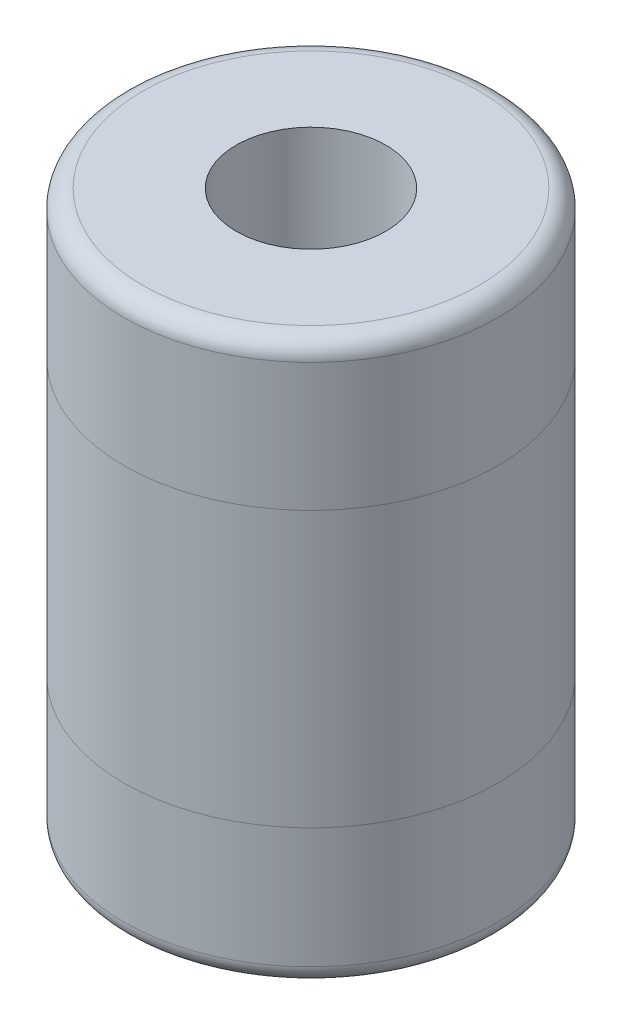
ISO-10303-21;
HEADER;
FILE_DESCRIPTION(('STEP AP214'),'2;1');
FILE_NAME('part.step','',(''),(''),'','','');
FILE_SCHEMA(('AUTOMOTIVE_DESIGN { 1 0 10303 214 1 1 1 1 }'));
ENDSEC;
DATA;
#1=APPLICATION_CONTEXT('core data for automotive mechanical design processes');
#2=APPLICATION_PROTOCOL_DEFINITION('international standard','automotive_design',2000,#1);
#3=PRODUCT_CONTEXT('',#1,'mechanical');
#4=PRODUCT('Part','Part','',(#3));
#5=PRODUCT_RELATED_PRODUCT_CATEGORY('part','',(#4));
#6=PRODUCT_DEFINITION_FORMATION('','',#4);
#7=PRODUCT_DEFINITION_CONTEXT('part definition',#1,'design');
#8=PRODUCT_DEFINITION('design','',#6,#7);
#9=PRODUCT_DEFINITION_SHAPE('','',#8);
#10=(LENGTH_UNIT() NAMED_UNIT(*) SI_UNIT(.MILLI.,.METRE.));
#11=(NAMED_UNIT(*) PLANE_ANGLE_UNIT() SI_UNIT($,.RADIAN.));
#12=(NAMED_UNIT(*) SI_UNIT($,.STERADIAN.) SOLID_ANGLE_UNIT());
#13=UNCERTAINTY_MEASURE_WITH_UNIT(LENGTH_MEASURE(1.E-05),#10,'distance_accuracy_value','');
#14=(GEOMETRIC_REPRESENTATION_CONTEXT(3) GLOBAL_UNCERTAINTY_ASSIGNED_CONTEXT((#13)) GLOBAL_UNIT_ASSIGNED_CONTEXT((#10,
#11,#12)) REPRESENTATION_CONTEXT('',''));
#15=CARTESIAN_POINT('',(0.,0.,0.));
#16=DIRECTION('',(0.,0.,1.));
#17=DIRECTION('',(1.,0.,0.));
#18=AXIS2_PLACEMENT_3D('',#15,#16,#17);
#19=CARTESIAN_POINT('',(0.,15.,0.));
#20=DIRECTION('',(0.,-1.,0.));
#21=DIRECTION('',(0.,0.,-1.));
#22=AXIS2_PLACEMENT_3D('',#19,#20,#21);
#23=CYLINDRICAL_SURFACE('',#22,10.);
#24=CARTESIAN_POINT('',(0.,-14.,0.));
#25=DIRECTION('',(0.,1.,0.));
#26=DIRECTION('',(0.,0.,1.));
#27=AXIS2_PLACEMENT_3D('',#24,#25,#26);
#28=CIRCLE('',#27,10.);
#29=CARTESIAN_POINT('',(0.,-14.,10.));
#30=VERTEX_POINT('',#29);
#31=EDGE_CURVE('E52',#30,#30,#28,.T.);
#32=ORIENTED_EDGE('',*,*,#31,.T.);
#33=EDGE_LOOP('',(#32));
#34=FACE_BOUND('',#33,.T.);
#35=CARTESIAN_POINT('',(0.,-7.56307177810811,0.));
#36=DIRECTION('',(0.,1.,0.));
#37=DIRECTION('',(0.,0.,1.));
#38=AXIS2_PLACEMENT_3D('',#35,#36,#37);
#39=CIRCLE('',#38,10.);
#40=CARTESIAN_POINT('',(0.,-7.56307177810811,10.));
#41=VERTEX_POINT('',#40);
#42=EDGE_CURVE('E57',#41,#41,#39,.T.);
#43=ORIENTED_EDGE('',*,*,#42,.F.);
#44=EDGE_LOOP('',(#43));
#45=FACE_BOUND('',#44,.T.);
#46=ADVANCED_FACE('F37',(#34,#45),#23,.T.);
#47=CARTESIAN_POINT('',(0.,14.,0.));
#48=DIRECTION('',(0.,1.,0.));
#49=DIRECTION('',(0.,0.,1.));
#50=AXIS2_PLACEMENT_3D('',#47,#48,#49);
#51=CIRCLE('',#50,10.);
#52=CARTESIAN_POINT('',(0.,14.,10.));
#53=VERTEX_POINT('',#52);
#54=EDGE_CURVE('E10',#53,#53,#51,.F.);
#55=ORIENTED_EDGE('',*,*,#54,.T.);
#56=EDGE_LOOP('',(#55));
#57=FACE_BOUND('',#56,.T.);
#58=CARTESIAN_POINT('',(0.,7.14538228133321,0.));
#59=DIRECTION('',(0.,-1.,0.));
#60=DIRECTION('',(0.,0.,-1.));
#61=AXIS2_PLACEMENT_3D('',#58,#59,#60);
#62=CIRCLE('',#61,10.);
#63=CARTESIAN_POINT('',(0.,7.14538228133321,-10.));
#64=VERTEX_POINT('',#63);
#65=EDGE_CURVE('E61',#64,#64,#62,.T.);
#66=ORIENTED_EDGE('',*,*,#65,.F.);
#67=EDGE_LOOP('',(#66));
#68=FACE_BOUND('',#67,.T.);
#69=ADVANCED_FACE('F91',(#57,#68),#23,.T.);
#70=ORIENTED_EDGE('',*,*,#42,.T.);
#71=EDGE_LOOP('',(#70));
#72=FACE_BOUND('',#71,.T.);
#73=ORIENTED_EDGE('',*,*,#65,.T.);
#74=EDGE_LOOP('',(#73));
#75=FACE_BOUND('',#74,.T.);
#76=ADVANCED_FACE('F83',(#72,#75),#23,.T.);
#77=CARTESIAN_POINT('',(0.,15.,0.));
#78=DIRECTION('',(0.,1.,0.));
#79=DIRECTION('',(0.,0.,1.));
#80=AXIS2_PLACEMENT_3D('',#77,#78,#79);
#81=PLANE('',#80);
#82=CARTESIAN_POINT('',(0.,15.,0.));
#83=DIRECTION('',(0.,1.,0.));
#84=DIRECTION('',(0.,0.,1.));
#85=AXIS2_PLACEMENT_3D('',#82,#83,#84);
#86=CIRCLE('',#85,9.);
#87=CARTESIAN_POINT('',(0.,15.,9.));
#88=VERTEX_POINT('',#87);
#89=EDGE_CURVE('E44',#88,#88,#86,.T.);
#90=ORIENTED_EDGE('',*,*,#89,.T.);
#91=EDGE_LOOP('',(#90));
#92=FACE_BOUND('',#91,.T.);
#93=CARTESIAN_POINT('',(0.,15.,0.));
#94=DIRECTION('',(0.,1.,0.));
#95=DIRECTION('',(0.,0.,1.));
#96=AXIS2_PLACEMENT_3D('',#93,#94,#95);
#97=CIRCLE('',#96,4.);
#98=CARTESIAN_POINT('',(0.,15.,4.));
#99=VERTEX_POINT('',#98);
#100=EDGE_CURVE('E66',#99,#99,#97,.T.);
#101=ORIENTED_EDGE('',*,*,#100,.F.);
#102=EDGE_LOOP('',(#101));
#103=FACE_BOUND('',#102,.T.);
#104=ADVANCED_FACE('F81',(#92,#103),#81,.T.);
#105=CARTESIAN_POINT('',(0.,-15.,0.));
#106=DIRECTION('',(0.,1.,0.));
#107=DIRECTION('',(0.,0.,1.));
#108=AXIS2_PLACEMENT_3D('',#105,#106,#107);
#109=PLANE('',#108);
#110=CARTESIAN_POINT('',(0.,-15.,0.));
#111=DIRECTION('',(0.,1.,0.));
#112=DIRECTION('',(0.,0.,1.));
#113=AXIS2_PLACEMENT_3D('',#110,#111,#112);
#114=CIRCLE('',#113,9.);
#115=CARTESIAN_POINT('',(0.,-15.,9.));
#116=VERTEX_POINT('',#115);
#117=EDGE_CURVE('E48',#116,#116,#114,.F.);
#118=ORIENTED_EDGE('',*,*,#117,.T.);
#119=EDGE_LOOP('',(#118));
#120=FACE_BOUND('',#119,.T.);
#121=CARTESIAN_POINT('',(0.,-15.,0.));
#122=DIRECTION('',(0.,1.,0.));
#123=DIRECTION('',(0.,0.,1.));
#124=AXIS2_PLACEMENT_3D('',#121,#122,#123);
#125=CIRCLE('',#124,4.);
#126=CARTESIAN_POINT('',(0.,-15.,4.));
#127=VERTEX_POINT('',#126);
#128=EDGE_CURVE('E65',#127,#127,#125,.T.);
#129=ORIENTED_EDGE('',*,*,#128,.T.);
#130=EDGE_LOOP('',(#129));
#131=FACE_BOUND('',#130,.T.);
#132=ADVANCED_FACE('F72',(#120,#131),#109,.F.);
#133=CARTESIAN_POINT('',(0.,-15.,0.));
#134=DIRECTION('',(0.,1.,0.));
#135=DIRECTION('',(0.,0.,1.));
#136=AXIS2_PLACEMENT_3D('',#133,#134,#135);
#137=CYLINDRICAL_SURFACE('',#136,4.);
#138=ORIENTED_EDGE('',*,*,#128,.F.);
#139=EDGE_LOOP('',(#138));
#140=FACE_BOUND('',#139,.T.);
#141=ORIENTED_EDGE('',*,*,#100,.T.);
#142=EDGE_LOOP('',(#141));
#143=FACE_BOUND('',#142,.T.);
#144=ADVANCED_FACE('F74',(#140,#143),#137,.F.);
#145=CARTESIAN_POINT('',(0.,-14.,0.));
#146=DIRECTION('',(0.,1.,0.));
#147=DIRECTION('',(0.,0.,1.));
#148=AXIS2_PLACEMENT_3D('',#145,#146,#147);
#149=TOROIDAL_SURFACE('',#148,9.,1.);
#150=ORIENTED_EDGE('',*,*,#117,.F.);
#151=EDGE_LOOP('',(#150));
#152=FACE_BOUND('',#151,.T.);
#153=ORIENTED_EDGE('',*,*,#31,.F.);
#154=EDGE_LOOP('',(#153));
#155=FACE_BOUND('',#154,.T.);
#156=ADVANCED_FACE('F77',(#152,#155),#149,.T.);
#157=CARTESIAN_POINT('',(0.,14.,0.));
#158=DIRECTION('',(0.,1.,0.));
#159=DIRECTION('',(0.,0.,1.));
#160=AXIS2_PLACEMENT_3D('',#157,#158,#159);
#161=TOROIDAL_SURFACE('',#160,9.,1.);
#162=ORIENTED_EDGE('',*,*,#54,.F.);
#163=EDGE_LOOP('',(#162));
#164=FACE_BOUND('',#163,.T.);
#165=ORIENTED_EDGE('',*,*,#89,.F.);
#166=EDGE_LOOP('',(#165));
#167=FACE_BOUND('',#166,.T.);
#168=ADVANCED_FACE('F39',(#164,#167),#161,.T.);
#169=CLOSED_SHELL('',(#46,#69,#76,#104,#132,#144,#156,#168));
#170=MANIFOLD_SOLID_BREP('B2',#169);
#171=ADVANCED_BREP_SHAPE_REPRESENTATION('',(#18,#170),#14);
#172=SHAPE_DEFINITION_REPRESENTATION(#9,#171);
ENDSEC;
END-ISO-10303-21;
